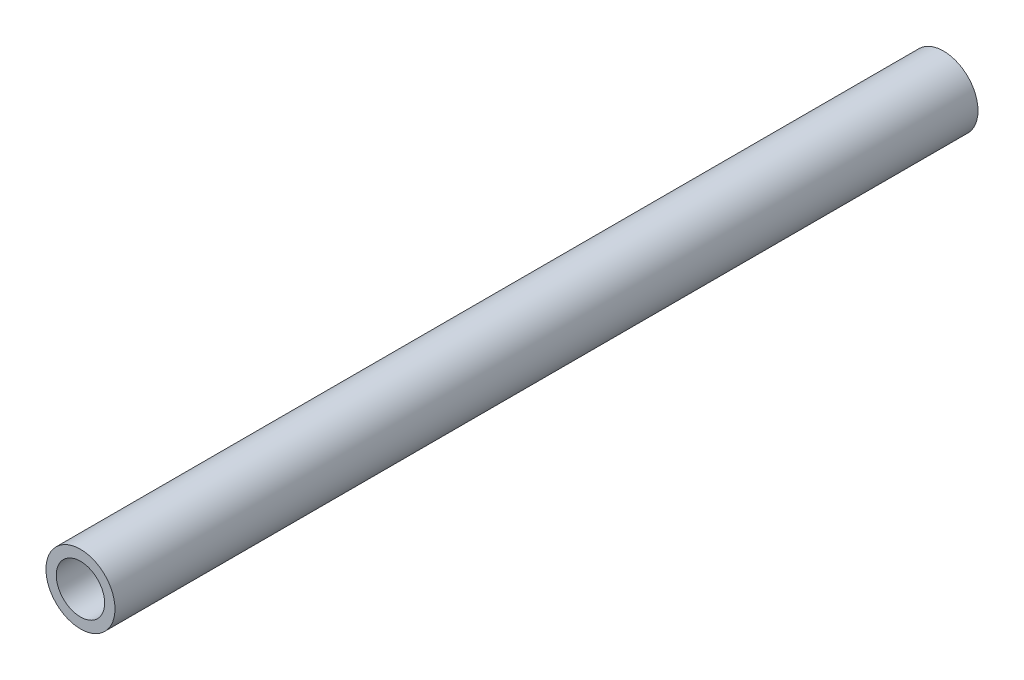
ISO-10303-21;
HEADER;
FILE_DESCRIPTION(('STEP AP214'),'2;1');
FILE_NAME('part.step','',(''),(''),'','','');
FILE_SCHEMA(('AUTOMOTIVE_DESIGN { 1 0 10303 214 1 1 1 1 }'));
ENDSEC;
DATA;
#1=APPLICATION_CONTEXT('core data for automotive mechanical design processes');
#2=APPLICATION_PROTOCOL_DEFINITION('international standard','automotive_design',2000,#1);
#3=PRODUCT_CONTEXT('',#1,'mechanical');
#4=PRODUCT('Part','Part','',(#3));
#5=PRODUCT_RELATED_PRODUCT_CATEGORY('part','',(#4));
#6=PRODUCT_DEFINITION_FORMATION('','',#4);
#7=PRODUCT_DEFINITION_CONTEXT('part definition',#1,'design');
#8=PRODUCT_DEFINITION('design','',#6,#7);
#9=PRODUCT_DEFINITION_SHAPE('','',#8);
#10=(LENGTH_UNIT() NAMED_UNIT(*) SI_UNIT(.MILLI.,.METRE.));
#11=(NAMED_UNIT(*) PLANE_ANGLE_UNIT() SI_UNIT($,.RADIAN.));
#12=(NAMED_UNIT(*) SI_UNIT($,.STERADIAN.) SOLID_ANGLE_UNIT());
#13=UNCERTAINTY_MEASURE_WITH_UNIT(LENGTH_MEASURE(1.E-05),#10,'distance_accuracy_value','');
#14=(GEOMETRIC_REPRESENTATION_CONTEXT(3) GLOBAL_UNCERTAINTY_ASSIGNED_CONTEXT((#13)) GLOBAL_UNIT_ASSIGNED_CONTEXT((#10,
#11,#12)) REPRESENTATION_CONTEXT('',''));
#15=CARTESIAN_POINT('',(0.,0.,0.));
#16=DIRECTION('',(0.,0.,1.));
#17=DIRECTION('',(1.,0.,0.));
#18=AXIS2_PLACEMENT_3D('',#15,#16,#17);
#19=CARTESIAN_POINT('',(0.,0.,250.));
#20=DIRECTION('',(0.,0.,1.));
#21=DIRECTION('',(1.,0.,0.));
#22=AXIS2_PLACEMENT_3D('',#19,#20,#21);
#23=PLANE('',#22);
#24=CARTESIAN_POINT('',(0.,0.,250.));
#25=DIRECTION('',(0.,0.,1.));
#26=DIRECTION('',(1.,0.,0.));
#27=AXIS2_PLACEMENT_3D('',#24,#25,#26);
#28=CIRCLE('',#27,10.);
#29=CARTESIAN_POINT('',(10.,0.,250.));
#30=VERTEX_POINT('',#29);
#31=EDGE_CURVE('E10',#30,#30,#28,.T.);
#32=ORIENTED_EDGE('',*,*,#31,.T.);
#33=EDGE_LOOP('',(#32));
#34=FACE_BOUND('',#33,.T.);
#35=CARTESIAN_POINT('',(0.,0.,250.));
#36=DIRECTION('',(0.,0.,1.));
#37=DIRECTION('',(1.,0.,0.));
#38=AXIS2_PLACEMENT_3D('',#35,#36,#37);
#39=CIRCLE('',#38,7.);
#40=CARTESIAN_POINT('',(7.,0.,250.));
#41=VERTEX_POINT('',#40);
#42=EDGE_CURVE('E52',#41,#41,#39,.T.);
#43=ORIENTED_EDGE('',*,*,#42,.F.);
#44=EDGE_LOOP('',(#43));
#45=FACE_BOUND('',#44,.T.);
#46=ADVANCED_FACE('F39',(#34,#45),#23,.T.);
#47=CARTESIAN_POINT('',(0.,0.,0.));
#48=DIRECTION('',(0.,0.,1.));
#49=DIRECTION('',(1.,0.,0.));
#50=AXIS2_PLACEMENT_3D('',#47,#48,#49);
#51=PLANE('',#50);
#52=CARTESIAN_POINT('',(0.,0.,0.));
#53=DIRECTION('',(0.,0.,1.));
#54=DIRECTION('',(1.,0.,0.));
#55=AXIS2_PLACEMENT_3D('',#52,#53,#54);
#56=CIRCLE('',#55,10.);
#57=CARTESIAN_POINT('',(10.,0.,0.));
#58=VERTEX_POINT('',#57);
#59=EDGE_CURVE('E43',#58,#58,#56,.T.);
#60=ORIENTED_EDGE('',*,*,#59,.F.);
#61=EDGE_LOOP('',(#60));
#62=FACE_BOUND('',#61,.T.);
#63=CARTESIAN_POINT('',(0.,0.,0.));
#64=DIRECTION('',(0.,0.,1.));
#65=DIRECTION('',(1.,0.,0.));
#66=AXIS2_PLACEMENT_3D('',#63,#64,#65);
#67=CIRCLE('',#66,7.);
#68=CARTESIAN_POINT('',(7.,0.,0.));
#69=VERTEX_POINT('',#68);
#70=EDGE_CURVE('E54',#69,#69,#67,.T.);
#71=ORIENTED_EDGE('',*,*,#70,.T.);
#72=EDGE_LOOP('',(#71));
#73=FACE_BOUND('',#72,.T.);
#74=ADVANCED_FACE('F66',(#62,#73),#51,.F.);
#75=CARTESIAN_POINT('',(0.,0.,250.));
#76=DIRECTION('',(0.,0.,-1.));
#77=DIRECTION('',(-1.,0.,0.));
#78=AXIS2_PLACEMENT_3D('',#75,#76,#77);
#79=CYLINDRICAL_SURFACE('',#78,10.);
#80=ORIENTED_EDGE('',*,*,#31,.F.);
#81=EDGE_LOOP('',(#80));
#82=FACE_BOUND('',#81,.T.);
#83=ORIENTED_EDGE('',*,*,#59,.T.);
#84=EDGE_LOOP('',(#83));
#85=FACE_BOUND('',#84,.T.);
#86=ADVANCED_FACE('F41',(#82,#85),#79,.T.);
#87=CARTESIAN_POINT('',(0.,0.,250.));
#88=DIRECTION('',(0.,0.,-1.));
#89=DIRECTION('',(-1.,0.,0.));
#90=AXIS2_PLACEMENT_3D('',#87,#88,#89);
#91=CYLINDRICAL_SURFACE('',#90,7.);
#92=ORIENTED_EDGE('',*,*,#42,.T.);
#93=EDGE_LOOP('',(#92));
#94=FACE_BOUND('',#93,.T.);
#95=ORIENTED_EDGE('',*,*,#70,.F.);
#96=EDGE_LOOP('',(#95));
#97=FACE_BOUND('',#96,.T.);
#98=ADVANCED_FACE('F62',(#94,#97),#91,.F.);
#99=CLOSED_SHELL('',(#46,#74,#86,#98));
#100=MANIFOLD_SOLID_BREP('B2',#99);
#101=ADVANCED_BREP_SHAPE_REPRESENTATION('',(#18,#100),#14);
#102=SHAPE_DEFINITION_REPRESENTATION(#9,#101);
ENDSEC;
END-ISO-10303-21;
